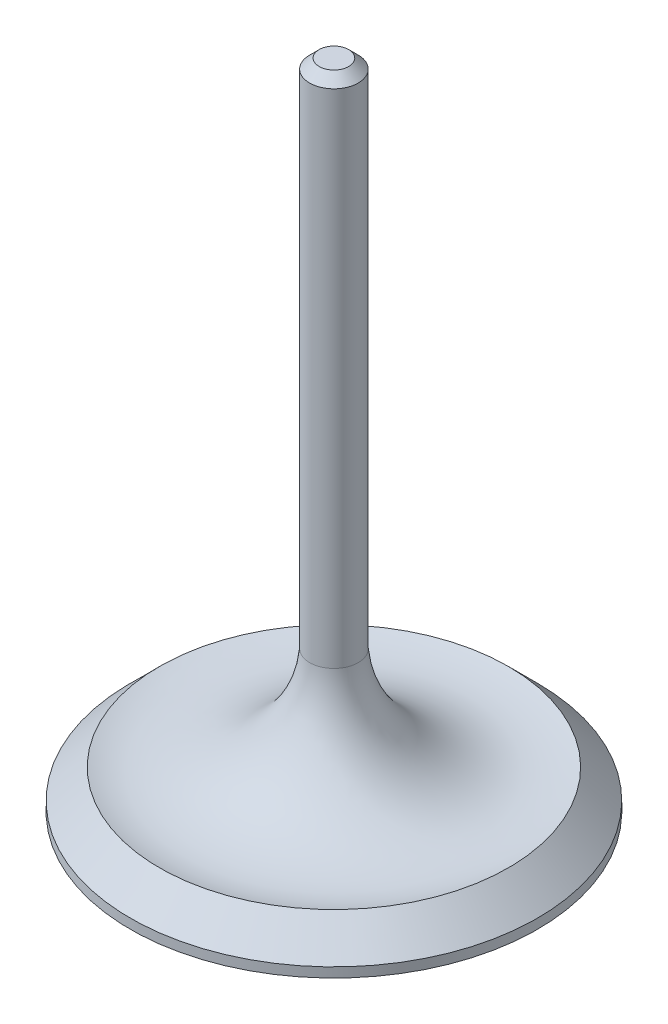
ISO-10303-21;
HEADER;
FILE_DESCRIPTION(('STEP AP214'),'2;1');
FILE_NAME('part.step','',(''),(''),'','','');
FILE_SCHEMA(('AUTOMOTIVE_DESIGN { 1 0 10303 214 1 1 1 1 }'));
ENDSEC;
DATA;
#1=APPLICATION_CONTEXT('core data for automotive mechanical design processes');
#2=APPLICATION_PROTOCOL_DEFINITION('international standard','automotive_design',2000,#1);
#3=PRODUCT_CONTEXT('',#1,'mechanical');
#4=PRODUCT('Part','Part','',(#3));
#5=PRODUCT_RELATED_PRODUCT_CATEGORY('part','',(#4));
#6=PRODUCT_DEFINITION_FORMATION('','',#4);
#7=PRODUCT_DEFINITION_CONTEXT('part definition',#1,'design');
#8=PRODUCT_DEFINITION('design','',#6,#7);
#9=PRODUCT_DEFINITION_SHAPE('','',#8);
#10=(LENGTH_UNIT() NAMED_UNIT(*) SI_UNIT(.MILLI.,.METRE.));
#11=(NAMED_UNIT(*) PLANE_ANGLE_UNIT() SI_UNIT($,.RADIAN.));
#12=(NAMED_UNIT(*) SI_UNIT($,.STERADIAN.) SOLID_ANGLE_UNIT());
#13=UNCERTAINTY_MEASURE_WITH_UNIT(LENGTH_MEASURE(1.E-05),#10,'distance_accuracy_value','');
#14=(GEOMETRIC_REPRESENTATION_CONTEXT(3) GLOBAL_UNCERTAINTY_ASSIGNED_CONTEXT((#13)) GLOBAL_UNIT_ASSIGNED_CONTEXT((#10,
#11,#12)) REPRESENTATION_CONTEXT('',''));
#15=CARTESIAN_POINT('',(0.,0.,0.));
#16=DIRECTION('',(0.,0.,1.));
#17=DIRECTION('',(1.,0.,0.));
#18=AXIS2_PLACEMENT_3D('',#15,#16,#17);
#19=CARTESIAN_POINT('',(0.,0.,-26.67));
#20=DIRECTION('',(0.,-1.,0.));
#21=DIRECTION('',(0.,0.,-1.));
#22=AXIS2_PLACEMENT_3D('',#19,#20,#21);
#23=PLANE('',#22);
#24=CARTESIAN_POINT('',(0.,0.,0.));
#25=DIRECTION('',(0.,-1.,0.));
#26=DIRECTION('',(0.,0.,-1.));
#27=AXIS2_PLACEMENT_3D('',#24,#25,#26);
#28=CIRCLE('',#27,26.67);
#29=CARTESIAN_POINT('',(0.,0.,-26.67));
#30=VERTEX_POINT('',#29);
#31=EDGE_CURVE('E53',#30,#30,#28,.T.);
#32=ORIENTED_EDGE('',*,*,#31,.T.);
#33=EDGE_LOOP('',(#32));
#34=FACE_BOUND('',#33,.T.);
#35=ADVANCED_FACE('F39',(#34),#23,.T.);
#36=CARTESIAN_POINT('',(0.,0.,0.));
#37=DIRECTION('',(0.,-1.,0.));
#38=DIRECTION('',(0.,0.,-1.));
#39=AXIS2_PLACEMENT_3D('',#36,#37,#38);
#40=CYLINDRICAL_SURFACE('',#39,26.67);
#41=CARTESIAN_POINT('',(0.,1.27,0.));
#42=DIRECTION('',(0.,-1.,0.));
#43=DIRECTION('',(0.,0.,-1.));
#44=AXIS2_PLACEMENT_3D('',#41,#42,#43);
#45=CIRCLE('',#44,26.67);
#46=CARTESIAN_POINT('',(0.,1.27,-26.67));
#47=VERTEX_POINT('',#46);
#48=EDGE_CURVE('E58',#47,#47,#45,.T.);
#49=ORIENTED_EDGE('',*,*,#48,.T.);
#50=EDGE_LOOP('',(#49));
#51=FACE_BOUND('',#50,.T.);
#52=ORIENTED_EDGE('',*,*,#31,.F.);
#53=EDGE_LOOP('',(#52));
#54=FACE_BOUND('',#53,.T.);
#55=ADVANCED_FACE('F88',(#51,#54),#40,.T.);
#56=CARTESIAN_POINT('',(0.,1.27,0.));
#57=DIRECTION('',(0.,-1.,0.));
#58=DIRECTION('',(0.,0.,-1.));
#59=AXIS2_PLACEMENT_3D('',#56,#57,#58);
#60=CONICAL_SURFACE('',#59,26.67,0.785398163397454);
#61=CARTESIAN_POINT('',(0.,5.08,0.));
#62=DIRECTION('',(0.,-1.,0.));
#63=DIRECTION('',(0.,0.,-1.));
#64=AXIS2_PLACEMENT_3D('',#61,#62,#63);
#65=CIRCLE('',#64,22.86);
#66=CARTESIAN_POINT('',(0.,5.08,-22.86));
#67=VERTEX_POINT('',#66);
#68=EDGE_CURVE('E64',#67,#67,#65,.T.);
#69=ORIENTED_EDGE('',*,*,#68,.T.);
#70=EDGE_LOOP('',(#69));
#71=FACE_BOUND('',#70,.T.);
#72=ORIENTED_EDGE('',*,*,#48,.F.);
#73=EDGE_LOOP('',(#72));
#74=FACE_BOUND('',#73,.T.);
#75=ADVANCED_FACE('F85',(#71,#74),#60,.T.);
#76=CARTESIAN_POINT('',(0.,19.6594194006116,0.));
#77=DIRECTION('',(0.,-1.,0.));
#78=DIRECTION('',(0.,0.,-1.));
#79=AXIS2_PLACEMENT_3D('',#76,#77,#78);
#80=TOROIDAL_SURFACE('',#79,18.3875253001197,15.25);
#81=CARTESIAN_POINT('',(0.,18.5220213848673,0.));
#82=DIRECTION('',(0.,-1.,0.));
#83=DIRECTION('',(0.,0.,-1.));
#84=AXIS2_PLACEMENT_3D('',#81,#82,#83);
#85=CIRCLE('',#84,3.18000000000001);
#86=CARTESIAN_POINT('',(0.,18.5220213848673,-3.18000000000001));
#87=VERTEX_POINT('',#86);
#88=EDGE_CURVE('E68',#87,#87,#85,.T.);
#89=ORIENTED_EDGE('',*,*,#88,.T.);
#90=EDGE_LOOP('',(#89));
#91=FACE_BOUND('',#90,.T.);
#92=ORIENTED_EDGE('',*,*,#68,.F.);
#93=EDGE_LOOP('',(#92));
#94=FACE_BOUND('',#93,.T.);
#95=ADVANCED_FACE('F73',(#91,#94),#80,.F.);
#96=CARTESIAN_POINT('',(0.,0.,0.));
#97=DIRECTION('',(0.,-1.,0.));
#98=DIRECTION('',(0.,0.,-1.));
#99=AXIS2_PLACEMENT_3D('',#96,#97,#98);
#100=CYLINDRICAL_SURFACE('',#99,3.18);
#101=CARTESIAN_POINT('',(0.,84.3,0.));
#102=DIRECTION('',(0.,1.,0.));
#103=DIRECTION('',(0.,0.,1.));
#104=AXIS2_PLACEMENT_3D('',#101,#102,#103);
#105=CIRCLE('',#104,3.18);
#106=CARTESIAN_POINT('',(0.,84.3,3.18));
#107=VERTEX_POINT('',#106);
#108=EDGE_CURVE('E48',#107,#107,#105,.F.);
#109=ORIENTED_EDGE('',*,*,#108,.T.);
#110=EDGE_LOOP('',(#109));
#111=FACE_BOUND('',#110,.T.);
#112=ORIENTED_EDGE('',*,*,#88,.F.);
#113=EDGE_LOOP('',(#112));
#114=FACE_BOUND('',#113,.T.);
#115=ADVANCED_FACE('F76',(#111,#114),#100,.T.);
#116=CARTESIAN_POINT('',(0.,85.55,0.));
#117=DIRECTION('',(0.,1.,0.));
#118=DIRECTION('',(0.,0.,1.));
#119=AXIS2_PLACEMENT_3D('',#116,#117,#118);
#120=PLANE('',#119);
#121=CARTESIAN_POINT('',(0.,85.55,0.));
#122=DIRECTION('',(0.,1.,0.));
#123=DIRECTION('',(0.,0.,1.));
#124=AXIS2_PLACEMENT_3D('',#121,#122,#123);
#125=CIRCLE('',#124,1.93000000000001);
#126=CARTESIAN_POINT('',(0.,85.55,1.93000000000001));
#127=VERTEX_POINT('',#126);
#128=EDGE_CURVE('E10',#127,#127,#125,.T.);
#129=ORIENTED_EDGE('',*,*,#128,.T.);
#130=EDGE_LOOP('',(#129));
#131=FACE_BOUND('',#130,.T.);
#132=ADVANCED_FACE('F78',(#131),#120,.T.);
#133=CARTESIAN_POINT('',(0.,84.3,0.));
#134=DIRECTION('',(0.,-1.,0.));
#135=DIRECTION('',(0.,0.,-1.));
#136=AXIS2_PLACEMENT_3D('',#133,#134,#135);
#137=CONICAL_SURFACE('',#136,3.18,0.785398163397443);
#138=ORIENTED_EDGE('',*,*,#128,.F.);
#139=EDGE_LOOP('',(#138));
#140=FACE_BOUND('',#139,.T.);
#141=ORIENTED_EDGE('',*,*,#108,.F.);
#142=EDGE_LOOP('',(#141));
#143=FACE_BOUND('',#142,.T.);
#144=ADVANCED_FACE('F42',(#140,#143),#137,.T.);
#145=CLOSED_SHELL('',(#35,#55,#75,#95,#115,#132,#144));
#146=MANIFOLD_SOLID_BREP('B2',#145);
#147=ADVANCED_BREP_SHAPE_REPRESENTATION('',(#18,#146),#14);
#148=SHAPE_DEFINITION_REPRESENTATION(#9,#147);
ENDSEC;
END-ISO-10303-21;
